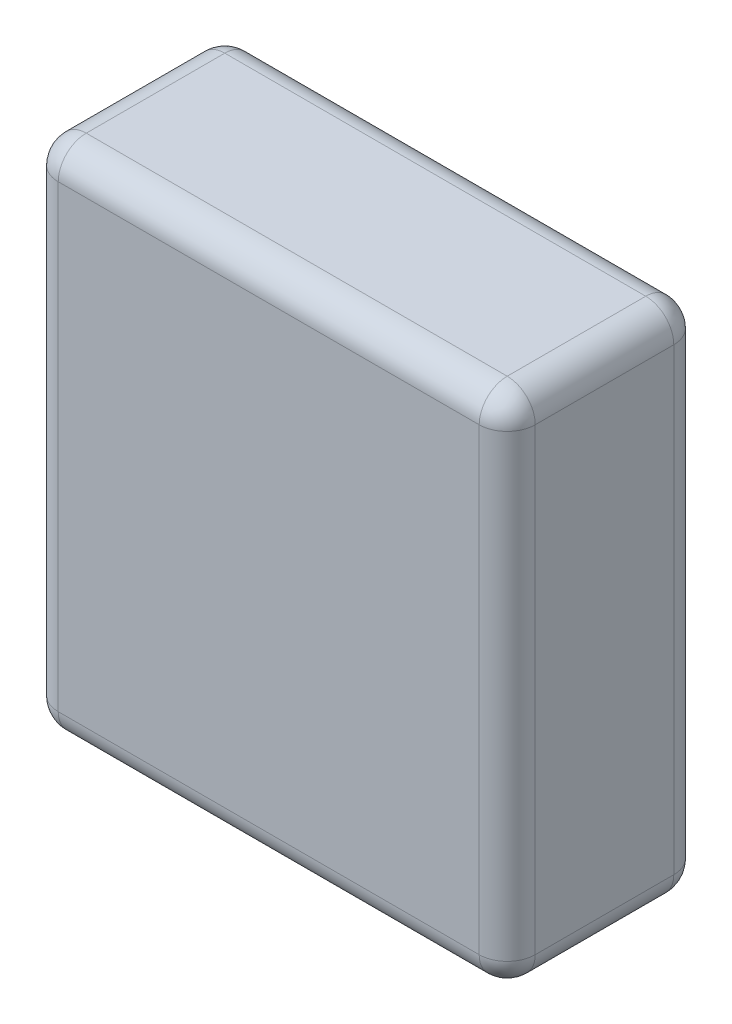
ISO-10303-21;
HEADER;
FILE_DESCRIPTION(('STEP AP214'),'2;1');
FILE_NAME('part.step','',(''),(''),'','','');
FILE_SCHEMA(('AUTOMOTIVE_DESIGN { 1 0 10303 214 1 1 1 1 }'));
ENDSEC;
DATA;
#1=APPLICATION_CONTEXT('core data for automotive mechanical design processes');
#2=APPLICATION_PROTOCOL_DEFINITION('international standard','automotive_design',2000,#1);
#3=PRODUCT_CONTEXT('',#1,'mechanical');
#4=PRODUCT('Part','Part','',(#3));
#5=PRODUCT_RELATED_PRODUCT_CATEGORY('part','',(#4));
#6=PRODUCT_DEFINITION_FORMATION('','',#4);
#7=PRODUCT_DEFINITION_CONTEXT('part definition',#1,'design');
#8=PRODUCT_DEFINITION('design','',#6,#7);
#9=PRODUCT_DEFINITION_SHAPE('','',#8);
#10=(LENGTH_UNIT() NAMED_UNIT(*) SI_UNIT(.MILLI.,.METRE.));
#11=(NAMED_UNIT(*) PLANE_ANGLE_UNIT() SI_UNIT($,.RADIAN.));
#12=(NAMED_UNIT(*) SI_UNIT($,.STERADIAN.) SOLID_ANGLE_UNIT());
#13=UNCERTAINTY_MEASURE_WITH_UNIT(LENGTH_MEASURE(1.E-05),#10,'distance_accuracy_value','');
#14=(GEOMETRIC_REPRESENTATION_CONTEXT(3) GLOBAL_UNCERTAINTY_ASSIGNED_CONTEXT((#13)) GLOBAL_UNIT_ASSIGNED_CONTEXT((#10,
#11,#12)) REPRESENTATION_CONTEXT('',''));
#15=CARTESIAN_POINT('',(0.,0.,0.));
#16=DIRECTION('',(0.,0.,1.));
#17=DIRECTION('',(1.,0.,0.));
#18=AXIS2_PLACEMENT_3D('',#15,#16,#17);
#19=CARTESIAN_POINT('',(0.,0.,20.828));
#20=DIRECTION('',(1.,0.,0.));
#21=DIRECTION('',(0.,0.,-1.));
#22=AXIS2_PLACEMENT_3D('',#19,#20,#21);
#23=PLANE('',#22);
#24=DIRECTION('',(0.,-1.,0.));
#25=VECTOR('',#24,1.);
#26=CARTESIAN_POINT('',(0.,0.,3.));
#27=LINE('',#26,#25);
#28=CARTESIAN_POINT('',(0.,52.118,3.));
#29=VERTEX_POINT('',#28);
#30=CARTESIAN_POINT('',(0.,3.,3.));
#31=VERTEX_POINT('',#30);
#32=EDGE_CURVE('E218',#29,#31,#27,.T.);
#33=ORIENTED_EDGE('',*,*,#32,.T.);
#34=DIRECTION('',(0.,0.,-1.));
#35=VECTOR('',#34,1.);
#36=CARTESIAN_POINT('',(0.,3.,20.828));
#37=LINE('',#36,#35);
#38=CARTESIAN_POINT('',(0.,3.,17.828));
#39=VERTEX_POINT('',#38);
#40=EDGE_CURVE('E226',#31,#39,#37,.F.);
#41=ORIENTED_EDGE('',*,*,#40,.T.);
#42=DIRECTION('',(0.,-1.,0.));
#43=VECTOR('',#42,1.);
#44=CARTESIAN_POINT('',(0.,0.,17.828));
#45=LINE('',#44,#43);
#46=CARTESIAN_POINT('',(0.,52.118,17.828));
#47=VERTEX_POINT('',#46);
#48=EDGE_CURVE('E215',#39,#47,#45,.F.);
#49=ORIENTED_EDGE('',*,*,#48,.T.);
#50=DIRECTION('',(0.,0.,-1.));
#51=VECTOR('',#50,1.);
#52=CARTESIAN_POINT('',(0.,52.118,20.828));
#53=LINE('',#52,#51);
#54=EDGE_CURVE('E212',#47,#29,#53,.T.);
#55=ORIENTED_EDGE('',*,*,#54,.T.);
#56=EDGE_LOOP('',(#33,#41,#49,#55));
#57=FACE_BOUND('',#56,.T.);
#58=ADVANCED_FACE('F33',(#57),#23,.F.);
#59=CARTESIAN_POINT('',(0.,0.,20.828));
#60=DIRECTION('',(0.,1.,0.));
#61=DIRECTION('',(0.,0.,1.));
#62=AXIS2_PLACEMENT_3D('',#59,#60,#61);
#63=PLANE('',#62);
#64=DIRECTION('',(0.,0.,-1.));
#65=VECTOR('',#64,1.);
#66=CARTESIAN_POINT('',(3.,0.,20.828));
#67=LINE('',#66,#65);
#68=CARTESIAN_POINT('',(3.,0.,17.828));
#69=VERTEX_POINT('',#68);
#70=CARTESIAN_POINT('',(3.,0.,3.));
#71=VERTEX_POINT('',#70);
#72=EDGE_CURVE('E131',#69,#71,#67,.T.);
#73=ORIENTED_EDGE('',*,*,#72,.T.);
#74=DIRECTION('',(1.,0.,0.));
#75=VECTOR('',#74,1.);
#76=CARTESIAN_POINT('',(51.054,0.,3.));
#77=LINE('',#76,#75);
#78=CARTESIAN_POINT('',(48.054,0.,3.));
#79=VERTEX_POINT('',#78);
#80=EDGE_CURVE('E127',#71,#79,#77,.T.);
#81=ORIENTED_EDGE('',*,*,#80,.T.);
#82=DIRECTION('',(0.,0.,-1.));
#83=VECTOR('',#82,1.);
#84=CARTESIAN_POINT('',(48.054,0.,20.828));
#85=LINE('',#84,#83);
#86=CARTESIAN_POINT('',(48.054,0.,17.828));
#87=VERTEX_POINT('',#86);
#88=EDGE_CURVE('E121',#79,#87,#85,.F.);
#89=ORIENTED_EDGE('',*,*,#88,.T.);
#90=DIRECTION('',(1.,0.,0.));
#91=VECTOR('',#90,1.);
#92=CARTESIAN_POINT('',(0.,0.,17.828));
#93=LINE('',#92,#91);
#94=EDGE_CURVE('E124',#87,#69,#93,.F.);
#95=ORIENTED_EDGE('',*,*,#94,.T.);
#96=EDGE_LOOP('',(#73,#81,#89,#95));
#97=FACE_BOUND('',#96,.T.);
#98=ADVANCED_FACE('F123',(#97),#63,.F.);
#99=CARTESIAN_POINT('',(51.054,0.,20.828));
#100=DIRECTION('',(-1.,0.,0.));
#101=DIRECTION('',(0.,0.,1.));
#102=AXIS2_PLACEMENT_3D('',#99,#100,#101);
#103=PLANE('',#102);
#104=DIRECTION('',(0.,1.,0.));
#105=VECTOR('',#104,1.);
#106=CARTESIAN_POINT('',(51.054,0.,17.828));
#107=LINE('',#106,#105);
#108=CARTESIAN_POINT('',(51.054,52.118,17.828));
#109=VERTEX_POINT('',#108);
#110=CARTESIAN_POINT('',(51.054,3.,17.828));
#111=VERTEX_POINT('',#110);
#112=EDGE_CURVE('E231',#109,#111,#107,.F.);
#113=ORIENTED_EDGE('',*,*,#112,.T.);
#114=DIRECTION('',(0.,0.,-1.));
#115=VECTOR('',#114,1.);
#116=CARTESIAN_POINT('',(51.054,3.,20.828));
#117=LINE('',#116,#115);
#118=CARTESIAN_POINT('',(51.054,3.,3.));
#119=VERTEX_POINT('',#118);
#120=EDGE_CURVE('E154',#111,#119,#117,.T.);
#121=ORIENTED_EDGE('',*,*,#120,.T.);
#122=DIRECTION('',(0.,1.,0.));
#123=VECTOR('',#122,1.);
#124=CARTESIAN_POINT('',(51.054,55.118,3.));
#125=LINE('',#124,#123);
#126=CARTESIAN_POINT('',(51.054,52.118,3.));
#127=VERTEX_POINT('',#126);
#128=EDGE_CURVE('E233',#119,#127,#125,.T.);
#129=ORIENTED_EDGE('',*,*,#128,.T.);
#130=DIRECTION('',(0.,0.,-1.));
#131=VECTOR('',#130,1.);
#132=CARTESIAN_POINT('',(51.054,52.118,20.828));
#133=LINE('',#132,#131);
#134=EDGE_CURVE('E229',#127,#109,#133,.F.);
#135=ORIENTED_EDGE('',*,*,#134,.T.);
#136=EDGE_LOOP('',(#113,#121,#129,#135));
#137=FACE_BOUND('',#136,.T.);
#138=ADVANCED_FACE('F288',(#137),#103,.F.);
#139=CARTESIAN_POINT('',(0.,55.118,20.828));
#140=DIRECTION('',(0.,-1.,0.));
#141=DIRECTION('',(0.,0.,-1.));
#142=AXIS2_PLACEMENT_3D('',#139,#140,#141);
#143=PLANE('',#142);
#144=DIRECTION('',(-1.,0.,0.));
#145=VECTOR('',#144,1.);
#146=CARTESIAN_POINT('',(0.,55.118,17.828));
#147=LINE('',#146,#145);
#148=CARTESIAN_POINT('',(3.,55.118,17.828));
#149=VERTEX_POINT('',#148);
#150=CARTESIAN_POINT('',(48.054,55.118,17.828));
#151=VERTEX_POINT('',#150);
#152=EDGE_CURVE('E42',#149,#151,#147,.F.);
#153=ORIENTED_EDGE('',*,*,#152,.T.);
#154=DIRECTION('',(0.,0.,-1.));
#155=VECTOR('',#154,1.);
#156=CARTESIAN_POINT('',(48.054,55.118,20.828));
#157=LINE('',#156,#155);
#158=CARTESIAN_POINT('',(48.054,55.118,3.));
#159=VERTEX_POINT('',#158);
#160=EDGE_CURVE('E11',#151,#159,#157,.T.);
#161=ORIENTED_EDGE('',*,*,#160,.T.);
#162=DIRECTION('',(-1.,0.,0.));
#163=VECTOR('',#162,1.);
#164=CARTESIAN_POINT('',(0.,55.118,3.));
#165=LINE('',#164,#163);
#166=CARTESIAN_POINT('',(3.,55.118,3.));
#167=VERTEX_POINT('',#166);
#168=EDGE_CURVE('E245',#159,#167,#165,.T.);
#169=ORIENTED_EDGE('',*,*,#168,.T.);
#170=DIRECTION('',(0.,0.,-1.));
#171=VECTOR('',#170,1.);
#172=CARTESIAN_POINT('',(3.,55.118,20.828));
#173=LINE('',#172,#171);
#174=EDGE_CURVE('E53',#167,#149,#173,.F.);
#175=ORIENTED_EDGE('',*,*,#174,.T.);
#176=EDGE_LOOP('',(#153,#161,#169,#175));
#177=FACE_BOUND('',#176,.T.);
#178=ADVANCED_FACE('F499',(#177),#143,.F.);
#179=CARTESIAN_POINT('',(0.,0.,20.828));
#180=DIRECTION('',(0.,0.,-1.));
#181=DIRECTION('',(-1.,0.,0.));
#182=AXIS2_PLACEMENT_3D('',#179,#180,#181);
#183=PLANE('',#182);
#184=DIRECTION('',(1.,0.,0.));
#185=VECTOR('',#184,1.);
#186=CARTESIAN_POINT('',(0.,3.,20.828));
#187=LINE('',#186,#185);
#188=CARTESIAN_POINT('',(3.,3.,20.828));
#189=VERTEX_POINT('',#188);
#190=CARTESIAN_POINT('',(48.054,3.,20.828));
#191=VERTEX_POINT('',#190);
#192=EDGE_CURVE('E240',#189,#191,#187,.T.);
#193=ORIENTED_EDGE('',*,*,#192,.T.);
#194=DIRECTION('',(0.,1.,0.));
#195=VECTOR('',#194,1.);
#196=CARTESIAN_POINT('',(48.054,0.,20.828));
#197=LINE('',#196,#195);
#198=CARTESIAN_POINT('',(48.054,52.118,20.828));
#199=VERTEX_POINT('',#198);
#200=EDGE_CURVE('E242',#191,#199,#197,.T.);
#201=ORIENTED_EDGE('',*,*,#200,.T.);
#202=DIRECTION('',(-1.,0.,0.));
#203=VECTOR('',#202,1.);
#204=CARTESIAN_POINT('',(0.,52.118,20.828));
#205=LINE('',#204,#203);
#206=CARTESIAN_POINT('',(3.,52.118,20.828));
#207=VERTEX_POINT('',#206);
#208=EDGE_CURVE('E236',#199,#207,#205,.T.);
#209=ORIENTED_EDGE('',*,*,#208,.T.);
#210=DIRECTION('',(0.,-1.,0.));
#211=VECTOR('',#210,1.);
#212=CARTESIAN_POINT('',(3.,0.,20.828));
#213=LINE('',#212,#211);
#214=EDGE_CURVE('E238',#207,#189,#213,.T.);
#215=ORIENTED_EDGE('',*,*,#214,.T.);
#216=EDGE_LOOP('',(#193,#201,#209,#215));
#217=FACE_BOUND('',#216,.T.);
#218=ADVANCED_FACE('F294',(#217),#183,.F.);
#219=CARTESIAN_POINT('',(0.,0.,0.));
#220=DIRECTION('',(0.,0.,-1.));
#221=DIRECTION('',(-1.,0.,0.));
#222=AXIS2_PLACEMENT_3D('',#219,#220,#221);
#223=PLANE('',#222);
#224=DIRECTION('',(0.,1.,0.));
#225=VECTOR('',#224,1.);
#226=CARTESIAN_POINT('',(48.054,0.,0.));
#227=LINE('',#226,#225);
#228=CARTESIAN_POINT('',(48.054,52.118,0.));
#229=VERTEX_POINT('',#228);
#230=CARTESIAN_POINT('',(48.054,3.,0.));
#231=VERTEX_POINT('',#230);
#232=EDGE_CURVE('E272',#229,#231,#227,.F.);
#233=ORIENTED_EDGE('',*,*,#232,.T.);
#234=DIRECTION('',(1.,0.,0.));
#235=VECTOR('',#234,1.);
#236=CARTESIAN_POINT('',(0.,3.,0.));
#237=LINE('',#236,#235);
#238=CARTESIAN_POINT('',(3.,3.,0.));
#239=VERTEX_POINT('',#238);
#240=EDGE_CURVE('E216',#231,#239,#237,.F.);
#241=ORIENTED_EDGE('',*,*,#240,.T.);
#242=DIRECTION('',(0.,-1.,0.));
#243=VECTOR('',#242,1.);
#244=CARTESIAN_POINT('',(3.,55.118,0.));
#245=LINE('',#244,#243);
#246=CARTESIAN_POINT('',(3.,52.118,0.));
#247=VERTEX_POINT('',#246);
#248=EDGE_CURVE('E221',#239,#247,#245,.F.);
#249=ORIENTED_EDGE('',*,*,#248,.T.);
#250=DIRECTION('',(-1.,0.,0.));
#251=VECTOR('',#250,1.);
#252=CARTESIAN_POINT('',(51.054,52.118,0.));
#253=LINE('',#252,#251);
#254=EDGE_CURVE('E306',#247,#229,#253,.F.);
#255=ORIENTED_EDGE('',*,*,#254,.T.);
#256=EDGE_LOOP('',(#233,#241,#249,#255));
#257=FACE_BOUND('',#256,.T.);
#258=ADVANCED_FACE('F274',(#257),#223,.T.);
#259=CARTESIAN_POINT('',(0.,52.118,17.828));
#260=DIRECTION('',(-1.,0.,0.));
#261=DIRECTION('',(0.,0.,1.));
#262=AXIS2_PLACEMENT_3D('',#259,#260,#261);
#263=CYLINDRICAL_SURFACE('',#262,3.);
#264=CARTESIAN_POINT('',(3.,52.118,17.828));
#265=DIRECTION('',(-1.,0.,0.));
#266=DIRECTION('',(0.,0.,1.));
#267=AXIS2_PLACEMENT_3D('',#264,#265,#266);
#268=CIRCLE('',#267,3.);
#269=EDGE_CURVE('E37',#207,#149,#268,.T.);
#270=ORIENTED_EDGE('',*,*,#269,.F.);
#271=ORIENTED_EDGE('',*,*,#208,.F.);
#272=CARTESIAN_POINT('',(48.054,52.118,17.828));
#273=DIRECTION('',(1.,0.,0.));
#274=DIRECTION('',(0.,0.,-1.));
#275=AXIS2_PLACEMENT_3D('',#272,#273,#274);
#276=CIRCLE('',#275,3.);
#277=EDGE_CURVE('E193',#151,#199,#276,.T.);
#278=ORIENTED_EDGE('',*,*,#277,.F.);
#279=ORIENTED_EDGE('',*,*,#152,.F.);
#280=EDGE_LOOP('',(#270,#271,#278,#279));
#281=FACE_BOUND('',#280,.T.);
#282=ADVANCED_FACE('F35',(#281),#263,.T.);
#283=CARTESIAN_POINT('',(3.,52.118,17.828));
#284=DIRECTION('',(0.,0.,1.));
#285=DIRECTION('',(1.,0.,0.));
#286=AXIS2_PLACEMENT_3D('',#283,#284,#285);
#287=SPHERICAL_SURFACE('',#286,3.);
#288=CARTESIAN_POINT('',(3.,52.118,17.828));
#289=DIRECTION('',(0.,1.,0.));
#290=DIRECTION('',(0.,0.,1.));
#291=AXIS2_PLACEMENT_3D('',#288,#289,#290);
#292=CIRCLE('',#291,3.);
#293=EDGE_CURVE('E188',#207,#47,#292,.F.);
#294=ORIENTED_EDGE('',*,*,#293,.F.);
#295=ORIENTED_EDGE('',*,*,#269,.T.);
#296=CARTESIAN_POINT('',(3.,52.118,17.828));
#297=DIRECTION('',(0.,0.,1.));
#298=DIRECTION('',(1.,0.,0.));
#299=AXIS2_PLACEMENT_3D('',#296,#297,#298);
#300=CIRCLE('',#299,3.);
#301=EDGE_CURVE('E191',#47,#149,#300,.F.);
#302=ORIENTED_EDGE('',*,*,#301,.F.);
#303=EDGE_LOOP('',(#294,#295,#302));
#304=FACE_BOUND('',#303,.T.);
#305=ADVANCED_FACE('F204',(#304),#287,.T.);
#306=CARTESIAN_POINT('',(48.054,52.118,17.828));
#307=DIRECTION('',(0.,0.,1.));
#308=DIRECTION('',(1.,0.,0.));
#309=AXIS2_PLACEMENT_3D('',#306,#307,#308);
#310=SPHERICAL_SURFACE('',#309,3.);
#311=CARTESIAN_POINT('',(48.054,52.118,17.828));
#312=DIRECTION('',(0.,0.,1.));
#313=DIRECTION('',(1.,0.,0.));
#314=AXIS2_PLACEMENT_3D('',#311,#312,#313);
#315=CIRCLE('',#314,3.);
#316=EDGE_CURVE('E183',#151,#109,#315,.F.);
#317=ORIENTED_EDGE('',*,*,#316,.F.);
#318=ORIENTED_EDGE('',*,*,#277,.T.);
#319=CARTESIAN_POINT('',(48.054,52.118,17.828));
#320=DIRECTION('',(0.,1.,0.));
#321=DIRECTION('',(0.,0.,1.));
#322=AXIS2_PLACEMENT_3D('',#319,#320,#321);
#323=CIRCLE('',#322,3.);
#324=EDGE_CURVE('E186',#109,#199,#323,.F.);
#325=ORIENTED_EDGE('',*,*,#324,.F.);
#326=EDGE_LOOP('',(#317,#318,#325));
#327=FACE_BOUND('',#326,.T.);
#328=ADVANCED_FACE('F320',(#327),#310,.T.);
#329=CARTESIAN_POINT('',(3.,52.118,20.828));
#330=DIRECTION('',(0.,0.,-1.));
#331=DIRECTION('',(-1.,0.,0.));
#332=AXIS2_PLACEMENT_3D('',#329,#330,#331);
#333=CYLINDRICAL_SURFACE('',#332,3.);
#334=ORIENTED_EDGE('',*,*,#301,.T.);
#335=ORIENTED_EDGE('',*,*,#174,.F.);
#336=CARTESIAN_POINT('',(3.,52.118,3.));
#337=DIRECTION('',(0.,0.,-1.));
#338=DIRECTION('',(-1.,0.,0.));
#339=AXIS2_PLACEMENT_3D('',#336,#337,#338);
#340=CIRCLE('',#339,3.);
#341=EDGE_CURVE('E177',#29,#167,#340,.T.);
#342=ORIENTED_EDGE('',*,*,#341,.F.);
#343=ORIENTED_EDGE('',*,*,#54,.F.);
#344=EDGE_LOOP('',(#334,#335,#342,#343));
#345=FACE_BOUND('',#344,.T.);
#346=ADVANCED_FACE('F209',(#345),#333,.T.);
#347=CARTESIAN_POINT('',(3.,0.,17.828));
#348=DIRECTION('',(0.,-1.,0.));
#349=DIRECTION('',(0.,0.,-1.));
#350=AXIS2_PLACEMENT_3D('',#347,#348,#349);
#351=CYLINDRICAL_SURFACE('',#350,3.);
#352=ORIENTED_EDGE('',*,*,#293,.T.);
#353=ORIENTED_EDGE('',*,*,#48,.F.);
#354=CARTESIAN_POINT('',(3.,3.,17.828));
#355=DIRECTION('',(0.,-1.,0.));
#356=DIRECTION('',(0.,0.,-1.));
#357=AXIS2_PLACEMENT_3D('',#354,#355,#356);
#358=CIRCLE('',#357,3.);
#359=EDGE_CURVE('E174',#189,#39,#358,.T.);
#360=ORIENTED_EDGE('',*,*,#359,.F.);
#361=ORIENTED_EDGE('',*,*,#214,.F.);
#362=EDGE_LOOP('',(#352,#353,#360,#361));
#363=FACE_BOUND('',#362,.T.);
#364=ADVANCED_FACE('F298',(#363),#351,.T.);
#365=CARTESIAN_POINT('',(0.,3.,17.828));
#366=DIRECTION('',(1.,0.,0.));
#367=DIRECTION('',(0.,0.,-1.));
#368=AXIS2_PLACEMENT_3D('',#365,#366,#367);
#369=CYLINDRICAL_SURFACE('',#368,3.);
#370=CARTESIAN_POINT('',(48.054,3.,17.828));
#371=DIRECTION('',(1.,0.,0.));
#372=DIRECTION('',(0.,0.,-1.));
#373=AXIS2_PLACEMENT_3D('',#370,#371,#372);
#374=CIRCLE('',#373,3.);
#375=EDGE_CURVE('E138',#191,#87,#374,.T.);
#376=ORIENTED_EDGE('',*,*,#375,.F.);
#377=ORIENTED_EDGE('',*,*,#192,.F.);
#378=CARTESIAN_POINT('',(3.,3.,17.828));
#379=DIRECTION('',(-1.,0.,0.));
#380=DIRECTION('',(0.,0.,1.));
#381=AXIS2_PLACEMENT_3D('',#378,#379,#380);
#382=CIRCLE('',#381,3.);
#383=EDGE_CURVE('E141',#69,#189,#382,.T.);
#384=ORIENTED_EDGE('',*,*,#383,.F.);
#385=ORIENTED_EDGE('',*,*,#94,.F.);
#386=EDGE_LOOP('',(#376,#377,#384,#385));
#387=FACE_BOUND('',#386,.T.);
#388=ADVANCED_FACE('F136',(#387),#369,.T.);
#389=CARTESIAN_POINT('',(48.054,0.,17.828));
#390=DIRECTION('',(0.,1.,0.));
#391=DIRECTION('',(0.,0.,1.));
#392=AXIS2_PLACEMENT_3D('',#389,#390,#391);
#393=CYLINDRICAL_SURFACE('',#392,3.);
#394=ORIENTED_EDGE('',*,*,#324,.T.);
#395=ORIENTED_EDGE('',*,*,#200,.F.);
#396=CARTESIAN_POINT('',(48.054,3.,17.828));
#397=DIRECTION('',(0.,-1.,0.));
#398=DIRECTION('',(0.,0.,-1.));
#399=AXIS2_PLACEMENT_3D('',#396,#397,#398);
#400=CIRCLE('',#399,3.);
#401=EDGE_CURVE('E150',#111,#191,#400,.T.);
#402=ORIENTED_EDGE('',*,*,#401,.F.);
#403=ORIENTED_EDGE('',*,*,#112,.F.);
#404=EDGE_LOOP('',(#394,#395,#402,#403));
#405=FACE_BOUND('',#404,.T.);
#406=ADVANCED_FACE('F292',(#405),#393,.T.);
#407=CARTESIAN_POINT('',(48.054,52.118,20.828));
#408=DIRECTION('',(0.,0.,-1.));
#409=DIRECTION('',(-1.,0.,0.));
#410=AXIS2_PLACEMENT_3D('',#407,#408,#409);
#411=CYLINDRICAL_SURFACE('',#410,3.);
#412=ORIENTED_EDGE('',*,*,#316,.T.);
#413=ORIENTED_EDGE('',*,*,#134,.F.);
#414=CARTESIAN_POINT('',(48.054,52.118,3.));
#415=DIRECTION('',(0.,0.,-1.));
#416=DIRECTION('',(-1.,0.,0.));
#417=AXIS2_PLACEMENT_3D('',#414,#415,#416);
#418=CIRCLE('',#417,3.);
#419=EDGE_CURVE('E169',#159,#127,#418,.T.);
#420=ORIENTED_EDGE('',*,*,#419,.F.);
#421=ORIENTED_EDGE('',*,*,#160,.F.);
#422=EDGE_LOOP('',(#412,#413,#420,#421));
#423=FACE_BOUND('',#422,.T.);
#424=ADVANCED_FACE('F319',(#423),#411,.T.);
#425=CARTESIAN_POINT('',(0.,52.118,3.));
#426=DIRECTION('',(1.,0.,0.));
#427=DIRECTION('',(0.,0.,-1.));
#428=AXIS2_PLACEMENT_3D('',#425,#426,#427);
#429=CYLINDRICAL_SURFACE('',#428,3.);
#430=CARTESIAN_POINT('',(3.,52.118,3.));
#431=DIRECTION('',(-1.,0.,0.));
#432=DIRECTION('',(0.,0.,1.));
#433=AXIS2_PLACEMENT_3D('',#430,#431,#432);
#434=CIRCLE('',#433,3.);
#435=EDGE_CURVE('E180',#167,#247,#434,.T.);
#436=ORIENTED_EDGE('',*,*,#435,.F.);
#437=ORIENTED_EDGE('',*,*,#168,.F.);
#438=CARTESIAN_POINT('',(48.054,52.118,3.));
#439=DIRECTION('',(1.,0.,0.));
#440=DIRECTION('',(0.,0.,-1.));
#441=AXIS2_PLACEMENT_3D('',#438,#439,#440);
#442=CIRCLE('',#441,3.);
#443=EDGE_CURVE('E167',#229,#159,#442,.T.);
#444=ORIENTED_EDGE('',*,*,#443,.F.);
#445=ORIENTED_EDGE('',*,*,#254,.F.);
#446=EDGE_LOOP('',(#436,#437,#444,#445));
#447=FACE_BOUND('',#446,.T.);
#448=ADVANCED_FACE('F313',(#447),#429,.T.);
#449=CARTESIAN_POINT('',(3.,52.118,3.));
#450=DIRECTION('',(0.,0.,1.));
#451=DIRECTION('',(1.,0.,0.));
#452=AXIS2_PLACEMENT_3D('',#449,#450,#451);
#453=SPHERICAL_SURFACE('',#452,3.);
#454=ORIENTED_EDGE('',*,*,#341,.T.);
#455=ORIENTED_EDGE('',*,*,#435,.T.);
#456=CARTESIAN_POINT('',(3.,52.118,3.));
#457=DIRECTION('',(0.,1.,0.));
#458=DIRECTION('',(0.,0.,1.));
#459=AXIS2_PLACEMENT_3D('',#456,#457,#458);
#460=CIRCLE('',#459,3.);
#461=EDGE_CURVE('E158',#29,#247,#460,.F.);
#462=ORIENTED_EDGE('',*,*,#461,.F.);
#463=EDGE_LOOP('',(#454,#455,#462));
#464=FACE_BOUND('',#463,.T.);
#465=ADVANCED_FACE('F356',(#464),#453,.T.);
#466=CARTESIAN_POINT('',(3.,3.,17.828));
#467=DIRECTION('',(0.,0.,1.));
#468=DIRECTION('',(1.,0.,0.));
#469=AXIS2_PLACEMENT_3D('',#466,#467,#468);
#470=SPHERICAL_SURFACE('',#469,3.);
#471=ORIENTED_EDGE('',*,*,#383,.T.);
#472=ORIENTED_EDGE('',*,*,#359,.T.);
#473=CARTESIAN_POINT('',(3.,3.,17.828));
#474=DIRECTION('',(0.,0.,1.));
#475=DIRECTION('',(1.,0.,0.));
#476=AXIS2_PLACEMENT_3D('',#473,#474,#475);
#477=CIRCLE('',#476,3.);
#478=EDGE_CURVE('E155',#69,#39,#477,.F.);
#479=ORIENTED_EDGE('',*,*,#478,.F.);
#480=EDGE_LOOP('',(#471,#472,#479));
#481=FACE_BOUND('',#480,.T.);
#482=ADVANCED_FACE('F300',(#481),#470,.T.);
#483=CARTESIAN_POINT('',(48.054,3.,17.828));
#484=DIRECTION('',(0.,0.,1.));
#485=DIRECTION('',(1.,0.,0.));
#486=AXIS2_PLACEMENT_3D('',#483,#484,#485);
#487=SPHERICAL_SURFACE('',#486,3.);
#488=ORIENTED_EDGE('',*,*,#401,.T.);
#489=ORIENTED_EDGE('',*,*,#375,.T.);
#490=CARTESIAN_POINT('',(48.054,3.,17.828));
#491=DIRECTION('',(0.,0.,1.));
#492=DIRECTION('',(1.,0.,0.));
#493=AXIS2_PLACEMENT_3D('',#490,#491,#492);
#494=CIRCLE('',#493,3.);
#495=EDGE_CURVE('E147',#111,#87,#494,.F.);
#496=ORIENTED_EDGE('',*,*,#495,.F.);
#497=EDGE_LOOP('',(#488,#489,#496));
#498=FACE_BOUND('',#497,.T.);
#499=ADVANCED_FACE('F146',(#498),#487,.T.);
#500=CARTESIAN_POINT('',(48.054,52.118,3.));
#501=DIRECTION('',(0.,0.,1.));
#502=DIRECTION('',(1.,0.,0.));
#503=AXIS2_PLACEMENT_3D('',#500,#501,#502);
#504=SPHERICAL_SURFACE('',#503,3.);
#505=ORIENTED_EDGE('',*,*,#443,.T.);
#506=ORIENTED_EDGE('',*,*,#419,.T.);
#507=CARTESIAN_POINT('',(48.054,52.118,3.));
#508=DIRECTION('',(0.,1.,0.));
#509=DIRECTION('',(0.,0.,1.));
#510=AXIS2_PLACEMENT_3D('',#507,#508,#509);
#511=CIRCLE('',#510,3.);
#512=EDGE_CURVE('E156',#229,#127,#511,.F.);
#513=ORIENTED_EDGE('',*,*,#512,.F.);
#514=EDGE_LOOP('',(#505,#506,#513));
#515=FACE_BOUND('',#514,.T.);
#516=ADVANCED_FACE('F316',(#515),#504,.T.);
#517=CARTESIAN_POINT('',(3.,0.,3.));
#518=DIRECTION('',(0.,1.,0.));
#519=DIRECTION('',(0.,0.,1.));
#520=AXIS2_PLACEMENT_3D('',#517,#518,#519);
#521=CYLINDRICAL_SURFACE('',#520,3.);
#522=ORIENTED_EDGE('',*,*,#461,.T.);
#523=ORIENTED_EDGE('',*,*,#248,.F.);
#524=CARTESIAN_POINT('',(3.,3.,3.));
#525=DIRECTION('',(0.,-1.,0.));
#526=DIRECTION('',(0.,0.,-1.));
#527=AXIS2_PLACEMENT_3D('',#524,#525,#526);
#528=CIRCLE('',#527,3.);
#529=EDGE_CURVE('E161',#31,#239,#528,.T.);
#530=ORIENTED_EDGE('',*,*,#529,.F.);
#531=ORIENTED_EDGE('',*,*,#32,.F.);
#532=EDGE_LOOP('',(#522,#523,#530,#531));
#533=FACE_BOUND('',#532,.T.);
#534=ADVANCED_FACE('F269',(#533),#521,.T.);
#535=CARTESIAN_POINT('',(3.,3.,20.828));
#536=DIRECTION('',(0.,0.,-1.));
#537=DIRECTION('',(-1.,0.,0.));
#538=AXIS2_PLACEMENT_3D('',#535,#536,#537);
#539=CYLINDRICAL_SURFACE('',#538,3.);
#540=ORIENTED_EDGE('',*,*,#478,.T.);
#541=ORIENTED_EDGE('',*,*,#40,.F.);
#542=CARTESIAN_POINT('',(3.,3.,3.));
#543=DIRECTION('',(0.,0.,-1.));
#544=DIRECTION('',(-1.,0.,0.));
#545=AXIS2_PLACEMENT_3D('',#542,#543,#544);
#546=CIRCLE('',#545,3.);
#547=EDGE_CURVE('E258',#71,#31,#546,.T.);
#548=ORIENTED_EDGE('',*,*,#547,.F.);
#549=ORIENTED_EDGE('',*,*,#72,.F.);
#550=EDGE_LOOP('',(#540,#541,#548,#549));
#551=FACE_BOUND('',#550,.T.);
#552=ADVANCED_FACE('F304',(#551),#539,.T.);
#553=CARTESIAN_POINT('',(48.054,3.,20.828));
#554=DIRECTION('',(0.,0.,-1.));
#555=DIRECTION('',(-1.,0.,0.));
#556=AXIS2_PLACEMENT_3D('',#553,#554,#555);
#557=CYLINDRICAL_SURFACE('',#556,3.);
#558=ORIENTED_EDGE('',*,*,#495,.T.);
#559=ORIENTED_EDGE('',*,*,#88,.F.);
#560=CARTESIAN_POINT('',(48.054,3.,3.));
#561=DIRECTION('',(0.,0.,-1.));
#562=DIRECTION('',(-1.,0.,0.));
#563=AXIS2_PLACEMENT_3D('',#560,#561,#562);
#564=CIRCLE('',#563,3.);
#565=EDGE_CURVE('E255',#119,#79,#564,.T.);
#566=ORIENTED_EDGE('',*,*,#565,.F.);
#567=ORIENTED_EDGE('',*,*,#120,.F.);
#568=EDGE_LOOP('',(#558,#559,#566,#567));
#569=FACE_BOUND('',#568,.T.);
#570=ADVANCED_FACE('F152',(#569),#557,.T.);
#571=CARTESIAN_POINT('',(48.054,0.,3.));
#572=DIRECTION('',(0.,-1.,0.));
#573=DIRECTION('',(0.,0.,-1.));
#574=AXIS2_PLACEMENT_3D('',#571,#572,#573);
#575=CYLINDRICAL_SURFACE('',#574,3.);
#576=ORIENTED_EDGE('',*,*,#512,.T.);
#577=ORIENTED_EDGE('',*,*,#128,.F.);
#578=CARTESIAN_POINT('',(48.054,3.,3.));
#579=DIRECTION('',(0.,-1.,0.));
#580=DIRECTION('',(0.,0.,-1.));
#581=AXIS2_PLACEMENT_3D('',#578,#579,#580);
#582=CIRCLE('',#581,3.);
#583=EDGE_CURVE('E253',#231,#119,#582,.T.);
#584=ORIENTED_EDGE('',*,*,#583,.F.);
#585=ORIENTED_EDGE('',*,*,#232,.F.);
#586=EDGE_LOOP('',(#576,#577,#584,#585));
#587=FACE_BOUND('',#586,.T.);
#588=ADVANCED_FACE('F284',(#587),#575,.T.);
#589=CARTESIAN_POINT('',(3.,3.,3.));
#590=DIRECTION('',(0.,0.,1.));
#591=DIRECTION('',(1.,0.,0.));
#592=AXIS2_PLACEMENT_3D('',#589,#590,#591);
#593=SPHERICAL_SURFACE('',#592,3.);
#594=ORIENTED_EDGE('',*,*,#547,.T.);
#595=ORIENTED_EDGE('',*,*,#529,.T.);
#596=CARTESIAN_POINT('',(3.,3.,3.));
#597=DIRECTION('',(-1.,0.,0.));
#598=DIRECTION('',(0.,0.,1.));
#599=AXIS2_PLACEMENT_3D('',#596,#597,#598);
#600=CIRCLE('',#599,3.);
#601=EDGE_CURVE('E251',#71,#239,#600,.F.);
#602=ORIENTED_EDGE('',*,*,#601,.F.);
#603=EDGE_LOOP('',(#594,#595,#602));
#604=FACE_BOUND('',#603,.T.);
#605=ADVANCED_FACE('F265',(#604),#593,.T.);
#606=CARTESIAN_POINT('',(48.054,3.,3.));
#607=DIRECTION('',(0.,0.,1.));
#608=DIRECTION('',(1.,0.,0.));
#609=AXIS2_PLACEMENT_3D('',#606,#607,#608);
#610=SPHERICAL_SURFACE('',#609,3.);
#611=ORIENTED_EDGE('',*,*,#583,.T.);
#612=ORIENTED_EDGE('',*,*,#565,.T.);
#613=CARTESIAN_POINT('',(48.054,3.,3.));
#614=DIRECTION('',(1.,0.,0.));
#615=DIRECTION('',(0.,0.,-1.));
#616=AXIS2_PLACEMENT_3D('',#613,#614,#615);
#617=CIRCLE('',#616,3.);
#618=EDGE_CURVE('E249',#231,#79,#617,.F.);
#619=ORIENTED_EDGE('',*,*,#618,.F.);
#620=EDGE_LOOP('',(#611,#612,#619));
#621=FACE_BOUND('',#620,.T.);
#622=ADVANCED_FACE('F281',(#621),#610,.T.);
#623=CARTESIAN_POINT('',(0.,3.,3.));
#624=DIRECTION('',(-1.,0.,0.));
#625=DIRECTION('',(0.,0.,1.));
#626=AXIS2_PLACEMENT_3D('',#623,#624,#625);
#627=CYLINDRICAL_SURFACE('',#626,3.);
#628=ORIENTED_EDGE('',*,*,#601,.T.);
#629=ORIENTED_EDGE('',*,*,#240,.F.);
#630=ORIENTED_EDGE('',*,*,#618,.T.);
#631=ORIENTED_EDGE('',*,*,#80,.F.);
#632=EDGE_LOOP('',(#628,#629,#630,#631));
#633=FACE_BOUND('',#632,.T.);
#634=ADVANCED_FACE('F279',(#633),#627,.T.);
#635=CLOSED_SHELL('',(#58,#98,#138,#178,#218,#258,#282,#305,#328,#346,#364,#388,#406,#424,#448,
#465,#482,#499,#516,#534,#552,#570,#588,#605,#622,#634));
#636=MANIFOLD_SOLID_BREP('B2',#635);
#637=ADVANCED_BREP_SHAPE_REPRESENTATION('',(#18,#636),#14);
#638=SHAPE_DEFINITION_REPRESENTATION(#9,#637);
ENDSEC;
END-ISO-10303-21;
